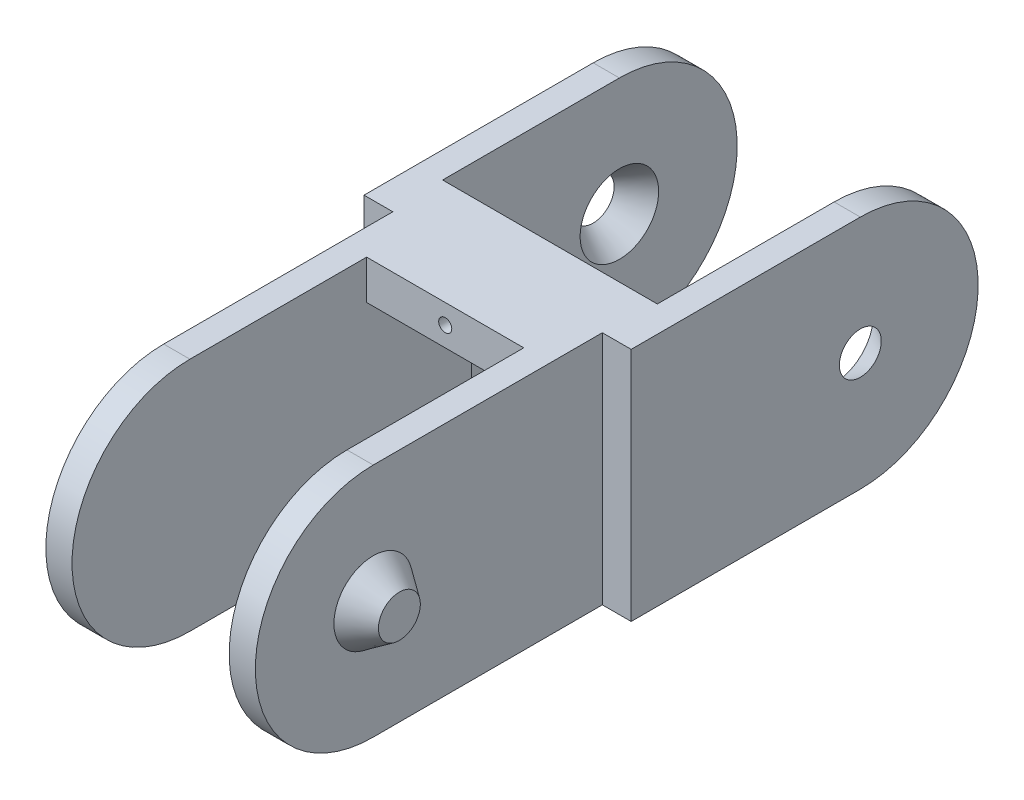
ISO-10303-21;
HEADER;
FILE_DESCRIPTION(('STEP AP214'),'2;1');
FILE_NAME('part.step','',(''),(''),'','','');
FILE_SCHEMA(('AUTOMOTIVE_DESIGN { 1 0 10303 214 1 1 1 1 }'));
ENDSEC;
DATA;
#1=APPLICATION_CONTEXT('core data for automotive mechanical design processes');
#2=APPLICATION_PROTOCOL_DEFINITION('international standard','automotive_design',2000,#1);
#3=PRODUCT_CONTEXT('',#1,'mechanical');
#4=PRODUCT('Part','Part','',(#3));
#5=PRODUCT_RELATED_PRODUCT_CATEGORY('part','',(#4));
#6=PRODUCT_DEFINITION_FORMATION('','',#4);
#7=PRODUCT_DEFINITION_CONTEXT('part definition',#1,'design');
#8=PRODUCT_DEFINITION('design','',#6,#7);
#9=PRODUCT_DEFINITION_SHAPE('','',#8);
#10=(LENGTH_UNIT() NAMED_UNIT(*) SI_UNIT(.MILLI.,.METRE.));
#11=(NAMED_UNIT(*) PLANE_ANGLE_UNIT() SI_UNIT($,.RADIAN.));
#12=(NAMED_UNIT(*) SI_UNIT($,.STERADIAN.) SOLID_ANGLE_UNIT());
#13=UNCERTAINTY_MEASURE_WITH_UNIT(LENGTH_MEASURE(1.E-05),#10,'distance_accuracy_value','');
#14=(GEOMETRIC_REPRESENTATION_CONTEXT(3) GLOBAL_UNCERTAINTY_ASSIGNED_CONTEXT((#13)) GLOBAL_UNIT_ASSIGNED_CONTEXT((#10,
#11,#12)) REPRESENTATION_CONTEXT('',''));
#15=CARTESIAN_POINT('',(0.,0.,0.));
#16=DIRECTION('',(0.,0.,1.));
#17=DIRECTION('',(1.,0.,0.));
#18=AXIS2_PLACEMENT_3D('',#15,#16,#17);
#19=CARTESIAN_POINT('',(0.,9.,4.));
#20=DIRECTION('',(0.,-1.,0.));
#21=DIRECTION('',(0.,0.,-1.));
#22=AXIS2_PLACEMENT_3D('',#19,#20,#21);
#23=PLANE('',#22);
#24=DIRECTION('',(-1.,0.,0.));
#25=VECTOR('',#24,1.);
#26=CARTESIAN_POINT('',(0.,9.,-4.));
#27=LINE('',#26,#25);
#28=CARTESIAN_POINT('',(8.2,9.,-4.));
#29=VERTEX_POINT('',#28);
#30=CARTESIAN_POINT('',(-8.2,9.,-4.));
#31=VERTEX_POINT('',#30);
#32=EDGE_CURVE('E393',#29,#31,#27,.T.);
#33=ORIENTED_EDGE('',*,*,#32,.T.);
#34=DIRECTION('',(0.,0.,-1.));
#35=VECTOR('',#34,1.);
#36=CARTESIAN_POINT('',(-8.2,9.,-4.));
#37=LINE('',#36,#35);
#38=CARTESIAN_POINT('',(-8.2,9.,-17.5));
#39=VERTEX_POINT('',#38);
#40=EDGE_CURVE('E273',#31,#39,#37,.T.);
#41=ORIENTED_EDGE('',*,*,#40,.T.);
#42=DIRECTION('',(1.,0.,0.));
#43=VECTOR('',#42,1.);
#44=CARTESIAN_POINT('',(-10.2,9.,-17.5));
#45=LINE('',#44,#43);
#46=CARTESIAN_POINT('',(-10.2,9.,-17.5));
#47=VERTEX_POINT('',#46);
#48=EDGE_CURVE('E300',#47,#39,#45,.T.);
#49=ORIENTED_EDGE('',*,*,#48,.F.);
#50=DIRECTION('',(0.,0.,1.));
#51=VECTOR('',#50,1.);
#52=CARTESIAN_POINT('',(-10.2,9.,0.));
#53=LINE('',#52,#51);
#54=CARTESIAN_POINT('',(-10.2,9.,0.));
#55=VERTEX_POINT('',#54);
#56=EDGE_CURVE('E284',#47,#55,#53,.T.);
#57=ORIENTED_EDGE('',*,*,#56,.T.);
#58=DIRECTION('',(1.,0.,0.));
#59=VECTOR('',#58,1.);
#60=CARTESIAN_POINT('',(-10.2,9.,0.));
#61=LINE('',#60,#59);
#62=CARTESIAN_POINT('',(-8.,9.,0.));
#63=VERTEX_POINT('',#62);
#64=EDGE_CURVE('E303',#55,#63,#61,.T.);
#65=ORIENTED_EDGE('',*,*,#64,.T.);
#66=DIRECTION('',(0.,0.,-1.));
#67=VECTOR('',#66,1.);
#68=CARTESIAN_POINT('',(-8.,9.,4.));
#69=LINE('',#68,#67);
#70=CARTESIAN_POINT('',(-8.,9.,17.5));
#71=VERTEX_POINT('',#70);
#72=EDGE_CURVE('E405',#71,#63,#69,.T.);
#73=ORIENTED_EDGE('',*,*,#72,.F.);
#74=DIRECTION('',(-1.,0.,0.));
#75=VECTOR('',#74,1.);
#76=CARTESIAN_POINT('',(38.0351369592827,9.,17.5));
#77=LINE('',#76,#75);
#78=CARTESIAN_POINT('',(-6.,9.,17.5));
#79=VERTEX_POINT('',#78);
#80=EDGE_CURVE('E311',#79,#71,#77,.T.);
#81=ORIENTED_EDGE('',*,*,#80,.F.);
#82=DIRECTION('',(0.,0.,1.));
#83=VECTOR('',#82,1.);
#84=CARTESIAN_POINT('',(-6.,9.,0.));
#85=LINE('',#84,#83);
#86=CARTESIAN_POINT('',(-6.,9.,4.));
#87=VERTEX_POINT('',#86);
#88=EDGE_CURVE('E320',#87,#79,#85,.T.);
#89=ORIENTED_EDGE('',*,*,#88,.F.);
#90=DIRECTION('',(-1.,0.,0.));
#91=VECTOR('',#90,1.);
#92=CARTESIAN_POINT('',(0.,9.,4.));
#93=LINE('',#92,#91);
#94=CARTESIAN_POINT('',(6.,9.,4.));
#95=VERTEX_POINT('',#94);
#96=EDGE_CURVE('E394',#95,#87,#93,.T.);
#97=ORIENTED_EDGE('',*,*,#96,.F.);
#98=DIRECTION('',(0.,0.,1.));
#99=VECTOR('',#98,1.);
#100=CARTESIAN_POINT('',(6.,9.,0.));
#101=LINE('',#100,#99);
#102=CARTESIAN_POINT('',(6.,9.,17.5));
#103=VERTEX_POINT('',#102);
#104=EDGE_CURVE('E377',#95,#103,#101,.T.);
#105=ORIENTED_EDGE('',*,*,#104,.T.);
#106=DIRECTION('',(1.,0.,0.));
#107=VECTOR('',#106,1.);
#108=CARTESIAN_POINT('',(-26.0351369592827,9.,17.5));
#109=LINE('',#108,#107);
#110=CARTESIAN_POINT('',(8.,9.,17.5));
#111=VERTEX_POINT('',#110);
#112=EDGE_CURVE('E379',#103,#111,#109,.T.);
#113=ORIENTED_EDGE('',*,*,#112,.T.);
#114=DIRECTION('',(0.,0.,-1.));
#115=VECTOR('',#114,1.);
#116=CARTESIAN_POINT('',(8.,9.,4.));
#117=LINE('',#116,#115);
#118=CARTESIAN_POINT('',(8.,9.,0.));
#119=VERTEX_POINT('',#118);
#120=EDGE_CURVE('E95',#111,#119,#117,.T.);
#121=ORIENTED_EDGE('',*,*,#120,.T.);
#122=DIRECTION('',(-1.,0.,0.));
#123=VECTOR('',#122,1.);
#124=CARTESIAN_POINT('',(10.2,9.,0.));
#125=LINE('',#124,#123);
#126=CARTESIAN_POINT('',(10.2,9.,0.));
#127=VERTEX_POINT('',#126);
#128=EDGE_CURVE('E357',#127,#119,#125,.T.);
#129=ORIENTED_EDGE('',*,*,#128,.F.);
#130=DIRECTION('',(0.,0.,1.));
#131=VECTOR('',#130,1.);
#132=CARTESIAN_POINT('',(10.2,9.,0.));
#133=LINE('',#132,#131);
#134=CARTESIAN_POINT('',(10.2,9.,-17.5));
#135=VERTEX_POINT('',#134);
#136=EDGE_CURVE('E355',#135,#127,#133,.T.);
#137=ORIENTED_EDGE('',*,*,#136,.F.);
#138=DIRECTION('',(-1.,0.,0.));
#139=VECTOR('',#138,1.);
#140=CARTESIAN_POINT('',(10.2,9.,-17.5));
#141=LINE('',#140,#139);
#142=CARTESIAN_POINT('',(8.2,9.,-17.5));
#143=VERTEX_POINT('',#142);
#144=EDGE_CURVE('E362',#135,#143,#141,.T.);
#145=ORIENTED_EDGE('',*,*,#144,.T.);
#146=DIRECTION('',(0.,0.,-1.));
#147=VECTOR('',#146,1.);
#148=CARTESIAN_POINT('',(8.2,9.,-4.));
#149=LINE('',#148,#147);
#150=EDGE_CURVE('E342',#29,#143,#149,.T.);
#151=ORIENTED_EDGE('',*,*,#150,.F.);
#152=EDGE_LOOP('',(#33,#41,#49,#57,#65,#73,#81,#89,#97,#105,#113,#121,#129,#137,#145,#151));
#153=FACE_BOUND('',#152,.T.);
#154=ADVANCED_FACE('F87',(#153),#23,.F.);
#155=CARTESIAN_POINT('',(0.,-9.,4.));
#156=DIRECTION('',(0.,1.,0.));
#157=DIRECTION('',(0.,0.,1.));
#158=AXIS2_PLACEMENT_3D('',#155,#156,#157);
#159=PLANE('',#158);
#160=DIRECTION('',(0.,0.,1.));
#161=VECTOR('',#160,1.);
#162=CARTESIAN_POINT('',(-8.2,-9.,-4.));
#163=LINE('',#162,#161);
#164=CARTESIAN_POINT('',(-8.2,-9.,-17.5));
#165=VERTEX_POINT('',#164);
#166=CARTESIAN_POINT('',(-8.2,-9.,-4.));
#167=VERTEX_POINT('',#166);
#168=EDGE_CURVE('E110',#165,#167,#163,.T.);
#169=ORIENTED_EDGE('',*,*,#168,.T.);
#170=DIRECTION('',(1.,0.,0.));
#171=VECTOR('',#170,1.);
#172=CARTESIAN_POINT('',(0.,-9.,-4.));
#173=LINE('',#172,#171);
#174=CARTESIAN_POINT('',(8.2,-9.,-4.));
#175=VERTEX_POINT('',#174);
#176=EDGE_CURVE('E396',#167,#175,#173,.T.);
#177=ORIENTED_EDGE('',*,*,#176,.T.);
#178=DIRECTION('',(0.,0.,1.));
#179=VECTOR('',#178,1.);
#180=CARTESIAN_POINT('',(8.2,-9.,-4.));
#181=LINE('',#180,#179);
#182=CARTESIAN_POINT('',(8.2,-9.,-17.5));
#183=VERTEX_POINT('',#182);
#184=EDGE_CURVE('E339',#183,#175,#181,.T.);
#185=ORIENTED_EDGE('',*,*,#184,.F.);
#186=DIRECTION('',(-1.,0.,0.));
#187=VECTOR('',#186,1.);
#188=CARTESIAN_POINT('',(10.2,-9.,-17.5));
#189=LINE('',#188,#187);
#190=CARTESIAN_POINT('',(10.2,-9.,-17.5));
#191=VERTEX_POINT('',#190);
#192=EDGE_CURVE('E365',#191,#183,#189,.T.);
#193=ORIENTED_EDGE('',*,*,#192,.F.);
#194=DIRECTION('',(0.,0.,-1.));
#195=VECTOR('',#194,1.);
#196=CARTESIAN_POINT('',(10.2,-9.,0.));
#197=LINE('',#196,#195);
#198=CARTESIAN_POINT('',(10.2,-9.,0.));
#199=VERTEX_POINT('',#198);
#200=EDGE_CURVE('E351',#199,#191,#197,.T.);
#201=ORIENTED_EDGE('',*,*,#200,.F.);
#202=DIRECTION('',(-1.,0.,0.));
#203=VECTOR('',#202,1.);
#204=CARTESIAN_POINT('',(10.2,-9.,0.));
#205=LINE('',#204,#203);
#206=CARTESIAN_POINT('',(8.,-9.,0.));
#207=VERTEX_POINT('',#206);
#208=EDGE_CURVE('E368',#199,#207,#205,.T.);
#209=ORIENTED_EDGE('',*,*,#208,.T.);
#210=DIRECTION('',(0.,0.,-1.));
#211=VECTOR('',#210,1.);
#212=CARTESIAN_POINT('',(8.,-9.,4.));
#213=LINE('',#212,#211);
#214=CARTESIAN_POINT('',(8.,-9.00000000000001,17.5));
#215=VERTEX_POINT('',#214);
#216=EDGE_CURVE('E398',#215,#207,#213,.T.);
#217=ORIENTED_EDGE('',*,*,#216,.F.);
#218=DIRECTION('',(1.,0.,0.));
#219=VECTOR('',#218,1.);
#220=CARTESIAN_POINT('',(-26.0351369592827,-9.00000000000001,17.5));
#221=LINE('',#220,#219);
#222=CARTESIAN_POINT('',(6.,-9.00000000000001,17.5));
#223=VERTEX_POINT('',#222);
#224=EDGE_CURVE('E381',#223,#215,#221,.T.);
#225=ORIENTED_EDGE('',*,*,#224,.F.);
#226=DIRECTION('',(0.,0.,-1.));
#227=VECTOR('',#226,1.);
#228=CARTESIAN_POINT('',(6.,-9.,0.));
#229=LINE('',#228,#227);
#230=CARTESIAN_POINT('',(6.,-9.,4.));
#231=VERTEX_POINT('',#230);
#232=EDGE_CURVE('E237',#223,#231,#229,.T.);
#233=ORIENTED_EDGE('',*,*,#232,.T.);
#234=DIRECTION('',(1.,0.,0.));
#235=VECTOR('',#234,1.);
#236=CARTESIAN_POINT('',(0.,-9.,4.));
#237=LINE('',#236,#235);
#238=CARTESIAN_POINT('',(-6.,-9.,4.));
#239=VERTEX_POINT('',#238);
#240=EDGE_CURVE('E232',#239,#231,#237,.T.);
#241=ORIENTED_EDGE('',*,*,#240,.F.);
#242=DIRECTION('',(0.,0.,-1.));
#243=VECTOR('',#242,1.);
#244=CARTESIAN_POINT('',(-6.,-9.,0.));
#245=LINE('',#244,#243);
#246=CARTESIAN_POINT('',(-6.,-9.00000000000001,17.5));
#247=VERTEX_POINT('',#246);
#248=EDGE_CURVE('E322',#247,#239,#245,.T.);
#249=ORIENTED_EDGE('',*,*,#248,.F.);
#250=DIRECTION('',(-1.,0.,0.));
#251=VECTOR('',#250,1.);
#252=CARTESIAN_POINT('',(38.0351369592827,-9.00000000000001,17.5));
#253=LINE('',#252,#251);
#254=CARTESIAN_POINT('',(-8.,-9.00000000000001,17.5));
#255=VERTEX_POINT('',#254);
#256=EDGE_CURVE('E315',#247,#255,#253,.T.);
#257=ORIENTED_EDGE('',*,*,#256,.T.);
#258=DIRECTION('',(0.,0.,-1.));
#259=VECTOR('',#258,1.);
#260=CARTESIAN_POINT('',(-8.,-9.,4.));
#261=LINE('',#260,#259);
#262=CARTESIAN_POINT('',(-8.,-9.,0.));
#263=VERTEX_POINT('',#262);
#264=EDGE_CURVE('E402',#255,#263,#261,.T.);
#265=ORIENTED_EDGE('',*,*,#264,.T.);
#266=DIRECTION('',(1.,0.,0.));
#267=VECTOR('',#266,1.);
#268=CARTESIAN_POINT('',(-10.2,-9.,0.));
#269=LINE('',#268,#267);
#270=CARTESIAN_POINT('',(-10.2,-9.,0.));
#271=VERTEX_POINT('',#270);
#272=EDGE_CURVE('E293',#271,#263,#269,.T.);
#273=ORIENTED_EDGE('',*,*,#272,.F.);
#274=DIRECTION('',(0.,0.,-1.));
#275=VECTOR('',#274,1.);
#276=CARTESIAN_POINT('',(-10.2,-9.,0.));
#277=LINE('',#276,#275);
#278=CARTESIAN_POINT('',(-10.2,-9.,-17.5));
#279=VERTEX_POINT('',#278);
#280=EDGE_CURVE('E290',#271,#279,#277,.T.);
#281=ORIENTED_EDGE('',*,*,#280,.T.);
#282=DIRECTION('',(1.,0.,0.));
#283=VECTOR('',#282,1.);
#284=CARTESIAN_POINT('',(-10.2,-9.,-17.5));
#285=LINE('',#284,#283);
#286=EDGE_CURVE('E297',#279,#165,#285,.T.);
#287=ORIENTED_EDGE('',*,*,#286,.T.);
#288=EDGE_LOOP('',(#169,#177,#185,#193,#201,#209,#217,#225,#233,#241,#249,#257,#265,#273,#281,#287));
#289=FACE_BOUND('',#288,.T.);
#290=ADVANCED_FACE('F431',(#289),#159,.F.);
#291=CARTESIAN_POINT('',(-10.2,0.,-17.5));
#292=DIRECTION('',(1.,0.,0.));
#293=DIRECTION('',(0.,0.,-1.));
#294=AXIS2_PLACEMENT_3D('',#291,#292,#293);
#295=CYLINDRICAL_SURFACE('',#294,9.);
#296=ORIENTED_EDGE('',*,*,#48,.T.);
#297=CARTESIAN_POINT('',(-8.2,0.,-17.5));
#298=DIRECTION('',(1.,0.,0.));
#299=DIRECTION('',(0.,0.,-1.));
#300=AXIS2_PLACEMENT_3D('',#297,#298,#299);
#301=CIRCLE('',#300,9.);
#302=EDGE_CURVE('E269',#165,#39,#301,.T.);
#303=ORIENTED_EDGE('',*,*,#302,.F.);
#304=ORIENTED_EDGE('',*,*,#286,.F.);
#305=CARTESIAN_POINT('',(-10.2,0.,-17.5));
#306=DIRECTION('',(1.,0.,0.));
#307=DIRECTION('',(0.,0.,1.));
#308=AXIS2_PLACEMENT_3D('',#305,#306,#307);
#309=CIRCLE('',#308,9.);
#310=EDGE_CURVE('E287',#279,#47,#309,.T.);
#311=ORIENTED_EDGE('',*,*,#310,.T.);
#312=EDGE_LOOP('',(#296,#303,#304,#311));
#313=FACE_BOUND('',#312,.T.);
#314=ADVANCED_FACE('F438',(#313),#295,.T.);
#315=CARTESIAN_POINT('',(0.,0.,4.));
#316=DIRECTION('',(0.,0.,1.));
#317=DIRECTION('',(1.,0.,0.));
#318=AXIS2_PLACEMENT_3D('',#315,#316,#317);
#319=PLANE('',#318);
#320=CARTESIAN_POINT('',(0.,-7.5,4.));
#321=DIRECTION('',(0.,0.,-1.));
#322=DIRECTION('',(1.,0.,0.));
#323=AXIS2_PLACEMENT_3D('',#320,#321,#322);
#324=CIRCLE('',#323,0.499999999999999);
#325=CARTESIAN_POINT('',(0.5,-7.5,4.));
#326=VERTEX_POINT('',#325);
#327=EDGE_CURVE('E477',#326,#326,#324,.T.);
#328=ORIENTED_EDGE('',*,*,#327,.T.);
#329=EDGE_LOOP('',(#328));
#330=FACE_BOUND('',#329,.T.);
#331=DIRECTION('',(0.,1.,0.));
#332=VECTOR('',#331,1.);
#333=CARTESIAN_POINT('',(-6.,0.,4.));
#334=LINE('',#333,#332);
#335=CARTESIAN_POINT('',(-6.,-6.,4.));
#336=VERTEX_POINT('',#335);
#337=EDGE_CURVE('E329',#239,#336,#334,.T.);
#338=ORIENTED_EDGE('',*,*,#337,.F.);
#339=ORIENTED_EDGE('',*,*,#240,.T.);
#340=DIRECTION('',(0.,-1.,0.));
#341=VECTOR('',#340,1.);
#342=CARTESIAN_POINT('',(6.,0.,4.));
#343=LINE('',#342,#341);
#344=CARTESIAN_POINT('',(6.,-6.,4.));
#345=VERTEX_POINT('',#344);
#346=EDGE_CURVE('E227',#345,#231,#343,.T.);
#347=ORIENTED_EDGE('',*,*,#346,.F.);
#348=DIRECTION('',(1.,0.,0.));
#349=VECTOR('',#348,1.);
#350=CARTESIAN_POINT('',(-6.,-6.,4.));
#351=LINE('',#350,#349);
#352=EDGE_CURVE('E230',#336,#345,#351,.T.);
#353=ORIENTED_EDGE('',*,*,#352,.F.);
#354=EDGE_LOOP('',(#338,#339,#347,#353));
#355=FACE_BOUND('',#354,.T.);
#356=ADVANCED_FACE('F229',(#330,#355),#319,.T.);
#357=CARTESIAN_POINT('',(8.,0.,4.));
#358=DIRECTION('',(-1.,0.,0.));
#359=DIRECTION('',(0.,0.,1.));
#360=AXIS2_PLACEMENT_3D('',#357,#358,#359);
#361=PLANE('',#360);
#362=CARTESIAN_POINT('',(8.,0.,17.5));
#363=DIRECTION('',(-1.,0.,0.));
#364=DIRECTION('',(0.,0.,1.));
#365=AXIS2_PLACEMENT_3D('',#362,#363,#364);
#366=CIRCLE('',#365,3.);
#367=CARTESIAN_POINT('',(8.,0.,20.5));
#368=VERTEX_POINT('',#367);
#369=EDGE_CURVE('E12',#368,#368,#366,.F.);
#370=ORIENTED_EDGE('',*,*,#369,.F.);
#371=EDGE_LOOP('',(#370));
#372=FACE_BOUND('',#371,.T.);
#373=ORIENTED_EDGE('',*,*,#216,.T.);
#374=DIRECTION('',(0.,-1.,0.));
#375=VECTOR('',#374,1.);
#376=CARTESIAN_POINT('',(8.,9.,0.));
#377=LINE('',#376,#375);
#378=EDGE_CURVE('E347',#119,#207,#377,.T.);
#379=ORIENTED_EDGE('',*,*,#378,.F.);
#380=ORIENTED_EDGE('',*,*,#120,.F.);
#381=CARTESIAN_POINT('',(8.,0.,17.5));
#382=DIRECTION('',(1.,0.,0.));
#383=DIRECTION('',(0.,0.,-1.));
#384=AXIS2_PLACEMENT_3D('',#381,#382,#383);
#385=CIRCLE('',#384,9.);
#386=EDGE_CURVE('E374',#111,#215,#385,.T.);
#387=ORIENTED_EDGE('',*,*,#386,.T.);
#388=EDGE_LOOP('',(#373,#379,#380,#387));
#389=FACE_BOUND('',#388,.T.);
#390=ADVANCED_FACE('F89',(#372,#389),#361,.F.);
#391=CARTESIAN_POINT('',(0.,7.5,4.));
#392=DIRECTION('',(0.,0.,1.));
#393=DIRECTION('',(1.,0.,0.));
#394=AXIS2_PLACEMENT_3D('',#391,#392,#393);
#395=CIRCLE('',#394,0.499999999999999);
#396=CARTESIAN_POINT('',(0.5,7.5,4.));
#397=VERTEX_POINT('',#396);
#398=EDGE_CURVE('E474',#397,#397,#395,.T.);
#399=ORIENTED_EDGE('',*,*,#398,.F.);
#400=EDGE_LOOP('',(#399));
#401=FACE_BOUND('',#400,.T.);
#402=CARTESIAN_POINT('',(-6.,6.,4.));
#403=VERTEX_POINT('',#402);
#404=EDGE_CURVE('E319',#403,#87,#334,.T.);
#405=ORIENTED_EDGE('',*,*,#404,.F.);
#406=DIRECTION('',(1.,0.,0.));
#407=VECTOR('',#406,1.);
#408=CARTESIAN_POINT('',(-6.,6.,4.));
#409=LINE('',#408,#407);
#410=CARTESIAN_POINT('',(6.,6.,4.));
#411=VERTEX_POINT('',#410);
#412=EDGE_CURVE('E256',#403,#411,#409,.T.);
#413=ORIENTED_EDGE('',*,*,#412,.T.);
#414=EDGE_CURVE('E236',#95,#411,#343,.T.);
#415=ORIENTED_EDGE('',*,*,#414,.F.);
#416=ORIENTED_EDGE('',*,*,#96,.T.);
#417=EDGE_LOOP('',(#405,#413,#415,#416));
#418=FACE_BOUND('',#417,.T.);
#419=ADVANCED_FACE('F463',(#401,#418),#319,.T.);
#420=CARTESIAN_POINT('',(0.,0.,-4.));
#421=DIRECTION('',(0.,0.,1.));
#422=DIRECTION('',(1.,0.,0.));
#423=AXIS2_PLACEMENT_3D('',#420,#421,#422);
#424=PLANE('',#423);
#425=CARTESIAN_POINT('',(0.,-7.5,-4.));
#426=DIRECTION('',(0.,0.,1.));
#427=DIRECTION('',(1.,0.,0.));
#428=AXIS2_PLACEMENT_3D('',#425,#426,#427);
#429=CIRCLE('',#428,0.499999999999999);
#430=CARTESIAN_POINT('',(0.5,-7.5,-4.));
#431=VERTEX_POINT('',#430);
#432=EDGE_CURVE('E478',#431,#431,#429,.T.);
#433=ORIENTED_EDGE('',*,*,#432,.T.);
#434=EDGE_LOOP('',(#433));
#435=FACE_BOUND('',#434,.T.);
#436=CARTESIAN_POINT('',(0.,7.5,-4.));
#437=DIRECTION('',(0.,0.,1.));
#438=DIRECTION('',(1.,0.,0.));
#439=AXIS2_PLACEMENT_3D('',#436,#437,#438);
#440=CIRCLE('',#439,0.499999999999999);
#441=CARTESIAN_POINT('',(0.5,7.5,-4.));
#442=VERTEX_POINT('',#441);
#443=EDGE_CURVE('E247',#442,#442,#440,.F.);
#444=ORIENTED_EDGE('',*,*,#443,.F.);
#445=EDGE_LOOP('',(#444));
#446=FACE_BOUND('',#445,.T.);
#447=DIRECTION('',(-1.,0.,0.));
#448=VECTOR('',#447,1.);
#449=CARTESIAN_POINT('',(-6.,-6.,-4.));
#450=LINE('',#449,#448);
#451=CARTESIAN_POINT('',(6.,-6.,-4.));
#452=VERTEX_POINT('',#451);
#453=CARTESIAN_POINT('',(-6.,-6.,-4.));
#454=VERTEX_POINT('',#453);
#455=EDGE_CURVE('E253',#452,#454,#450,.T.);
#456=ORIENTED_EDGE('',*,*,#455,.F.);
#457=DIRECTION('',(0.,1.,0.));
#458=VECTOR('',#457,1.);
#459=CARTESIAN_POINT('',(6.,-7.,-4.));
#460=LINE('',#459,#458);
#461=CARTESIAN_POINT('',(6.,6.,-4.));
#462=VERTEX_POINT('',#461);
#463=EDGE_CURVE('E251',#452,#462,#460,.T.);
#464=ORIENTED_EDGE('',*,*,#463,.T.);
#465=DIRECTION('',(-1.,0.,0.));
#466=VECTOR('',#465,1.);
#467=CARTESIAN_POINT('',(-6.,6.,-4.));
#468=LINE('',#467,#466);
#469=CARTESIAN_POINT('',(-6.,6.,-4.));
#470=VERTEX_POINT('',#469);
#471=EDGE_CURVE('E262',#462,#470,#468,.T.);
#472=ORIENTED_EDGE('',*,*,#471,.T.);
#473=DIRECTION('',(0.,-1.,0.));
#474=VECTOR('',#473,1.);
#475=CARTESIAN_POINT('',(-6.,-7.,-4.));
#476=LINE('',#475,#474);
#477=EDGE_CURVE('E390',#470,#454,#476,.T.);
#478=ORIENTED_EDGE('',*,*,#477,.T.);
#479=EDGE_LOOP('',(#456,#464,#472,#478));
#480=FACE_BOUND('',#479,.T.);
#481=DIRECTION('',(0.,1.,0.));
#482=VECTOR('',#481,1.);
#483=CARTESIAN_POINT('',(8.2,-9.001,-4.));
#484=LINE('',#483,#482);
#485=EDGE_CURVE('E344',#175,#29,#484,.T.);
#486=ORIENTED_EDGE('',*,*,#485,.F.);
#487=ORIENTED_EDGE('',*,*,#176,.F.);
#488=DIRECTION('',(0.,1.,0.));
#489=VECTOR('',#488,1.);
#490=CARTESIAN_POINT('',(-8.2,-9.001,-4.));
#491=LINE('',#490,#489);
#492=EDGE_CURVE('E276',#167,#31,#491,.T.);
#493=ORIENTED_EDGE('',*,*,#492,.T.);
#494=ORIENTED_EDGE('',*,*,#32,.F.);
#495=EDGE_LOOP('',(#486,#487,#493,#494));
#496=FACE_BOUND('',#495,.T.);
#497=ADVANCED_FACE('F434',(#435,#446,#480,#496),#424,.F.);
#498=CARTESIAN_POINT('',(-8.,0.,4.));
#499=DIRECTION('',(1.,0.,0.));
#500=DIRECTION('',(0.,0.,-1.));
#501=AXIS2_PLACEMENT_3D('',#498,#499,#500);
#502=PLANE('',#501);
#503=CARTESIAN_POINT('',(-8.,0.,17.5));
#504=DIRECTION('',(1.,0.,0.));
#505=DIRECTION('',(0.,0.,-1.));
#506=AXIS2_PLACEMENT_3D('',#503,#504,#505);
#507=CIRCLE('',#506,3.);
#508=CARTESIAN_POINT('',(-8.,0.,14.5));
#509=VERTEX_POINT('',#508);
#510=EDGE_CURVE('E305',#509,#509,#507,.T.);
#511=ORIENTED_EDGE('',*,*,#510,.T.);
#512=EDGE_LOOP('',(#511));
#513=FACE_BOUND('',#512,.T.);
#514=ORIENTED_EDGE('',*,*,#72,.T.);
#515=DIRECTION('',(0.,-1.,0.));
#516=VECTOR('',#515,1.);
#517=CARTESIAN_POINT('',(-8.,9.,0.));
#518=LINE('',#517,#516);
#519=EDGE_CURVE('E280',#63,#263,#518,.T.);
#520=ORIENTED_EDGE('',*,*,#519,.T.);
#521=ORIENTED_EDGE('',*,*,#264,.F.);
#522=CARTESIAN_POINT('',(-8.,0.,17.5));
#523=DIRECTION('',(1.,0.,0.));
#524=DIRECTION('',(0.,0.,-1.));
#525=AXIS2_PLACEMENT_3D('',#522,#523,#524);
#526=CIRCLE('',#525,9.);
#527=EDGE_CURVE('E312',#71,#255,#526,.T.);
#528=ORIENTED_EDGE('',*,*,#527,.F.);
#529=EDGE_LOOP('',(#514,#520,#521,#528));
#530=FACE_BOUND('',#529,.T.);
#531=ADVANCED_FACE('F450',(#513,#530),#502,.F.);
#532=CARTESIAN_POINT('',(6.,-7.,4.));
#533=DIRECTION('',(-1.,0.,0.));
#534=DIRECTION('',(0.,0.,1.));
#535=AXIS2_PLACEMENT_3D('',#532,#533,#534);
#536=PLANE('',#535);
#537=DIRECTION('',(0.,0.,1.));
#538=VECTOR('',#537,1.);
#539=CARTESIAN_POINT('',(6.,-6.,-16.0415945787923));
#540=LINE('',#539,#538);
#541=EDGE_CURVE('E243',#452,#345,#540,.T.);
#542=ORIENTED_EDGE('',*,*,#541,.T.);
#543=ORIENTED_EDGE('',*,*,#346,.T.);
#544=ORIENTED_EDGE('',*,*,#232,.F.);
#545=CARTESIAN_POINT('',(6.,0.,17.5));
#546=DIRECTION('',(-1.,0.,0.));
#547=DIRECTION('',(0.,0.,1.));
#548=AXIS2_PLACEMENT_3D('',#545,#546,#547);
#549=CIRCLE('',#548,9.);
#550=EDGE_CURVE('E382',#103,#223,#549,.F.);
#551=ORIENTED_EDGE('',*,*,#550,.F.);
#552=ORIENTED_EDGE('',*,*,#104,.F.);
#553=ORIENTED_EDGE('',*,*,#414,.T.);
#554=DIRECTION('',(0.,0.,1.));
#555=VECTOR('',#554,1.);
#556=CARTESIAN_POINT('',(6.,6.,-16.0415945787923));
#557=LINE('',#556,#555);
#558=EDGE_CURVE('E259',#462,#411,#557,.T.);
#559=ORIENTED_EDGE('',*,*,#558,.F.);
#560=ORIENTED_EDGE('',*,*,#463,.F.);
#561=EDGE_LOOP('',(#542,#543,#544,#551,#552,#553,#559,#560));
#562=FACE_BOUND('',#561,.T.);
#563=ADVANCED_FACE('F249',(#562),#536,.T.);
#564=CARTESIAN_POINT('',(-6.,-7.,4.));
#565=DIRECTION('',(1.,0.,0.));
#566=DIRECTION('',(0.,0.,-1.));
#567=AXIS2_PLACEMENT_3D('',#564,#565,#566);
#568=PLANE('',#567);
#569=ORIENTED_EDGE('',*,*,#337,.T.);
#570=DIRECTION('',(0.,0.,1.));
#571=VECTOR('',#570,1.);
#572=CARTESIAN_POINT('',(-6.,-6.,-16.0415945787923));
#573=LINE('',#572,#571);
#574=EDGE_CURVE('E246',#454,#336,#573,.T.);
#575=ORIENTED_EDGE('',*,*,#574,.F.);
#576=ORIENTED_EDGE('',*,*,#477,.F.);
#577=DIRECTION('',(0.,0.,1.));
#578=VECTOR('',#577,1.);
#579=CARTESIAN_POINT('',(-6.,6.,-16.0415945787923));
#580=LINE('',#579,#578);
#581=EDGE_CURVE('E102',#470,#403,#580,.T.);
#582=ORIENTED_EDGE('',*,*,#581,.T.);
#583=ORIENTED_EDGE('',*,*,#404,.T.);
#584=ORIENTED_EDGE('',*,*,#88,.T.);
#585=CARTESIAN_POINT('',(-6.,0.,17.5));
#586=DIRECTION('',(1.,0.,0.));
#587=DIRECTION('',(0.,0.,-1.));
#588=AXIS2_PLACEMENT_3D('',#585,#586,#587);
#589=CIRCLE('',#588,9.);
#590=EDGE_CURVE('E316',#79,#247,#589,.T.);
#591=ORIENTED_EDGE('',*,*,#590,.T.);
#592=ORIENTED_EDGE('',*,*,#248,.T.);
#593=EDGE_LOOP('',(#569,#575,#576,#582,#583,#584,#591,#592));
#594=FACE_BOUND('',#593,.T.);
#595=ADVANCED_FACE('F460',(#594),#568,.T.);
#596=CARTESIAN_POINT('',(-26.0351369592827,0.,17.5));
#597=DIRECTION('',(1.,0.,0.));
#598=DIRECTION('',(0.,0.,-1.));
#599=AXIS2_PLACEMENT_3D('',#596,#597,#598);
#600=CYLINDRICAL_SURFACE('',#599,9.);
#601=ORIENTED_EDGE('',*,*,#112,.F.);
#602=ORIENTED_EDGE('',*,*,#550,.T.);
#603=ORIENTED_EDGE('',*,*,#224,.T.);
#604=ORIENTED_EDGE('',*,*,#386,.F.);
#605=EDGE_LOOP('',(#601,#602,#603,#604));
#606=FACE_BOUND('',#605,.T.);
#607=ADVANCED_FACE('F468',(#606),#600,.T.);
#608=CARTESIAN_POINT('',(8.,0.,17.5));
#609=DIRECTION('',(-1.,0.,0.));
#610=DIRECTION('',(0.,0.,-1.));
#611=AXIS2_PLACEMENT_3D('',#608,#609,#610);
#612=CONICAL_SURFACE('',#611,3.,0.610865238198016);
#613=CARTESIAN_POINT('',(10.,0.,17.5));
#614=DIRECTION('',(1.,0.,0.));
#615=DIRECTION('',(0.,0.,-1.));
#616=AXIS2_PLACEMENT_3D('',#613,#614,#615);
#617=CIRCLE('',#616,1.59958492358058);
#618=CARTESIAN_POINT('',(10.,0.,15.9004150764194));
#619=VERTEX_POINT('',#618);
#620=EDGE_CURVE('E371',#619,#619,#617,.T.);
#621=ORIENTED_EDGE('',*,*,#620,.F.);
#622=EDGE_LOOP('',(#621));
#623=FACE_BOUND('',#622,.T.);
#624=ORIENTED_EDGE('',*,*,#369,.T.);
#625=EDGE_LOOP('',(#624));
#626=FACE_BOUND('',#625,.T.);
#627=ADVANCED_FACE('F524',(#623,#626),#612,.T.);
#628=CARTESIAN_POINT('',(10.,0.,17.5));
#629=DIRECTION('',(1.,0.,0.));
#630=DIRECTION('',(0.,0.,-1.));
#631=AXIS2_PLACEMENT_3D('',#628,#629,#630);
#632=PLANE('',#631);
#633=ORIENTED_EDGE('',*,*,#620,.T.);
#634=EDGE_LOOP('',(#633));
#635=FACE_BOUND('',#634,.T.);
#636=ADVANCED_FACE('F527',(#635),#632,.T.);
#637=CARTESIAN_POINT('',(10.2,9.,0.));
#638=DIRECTION('',(0.,0.,-1.));
#639=DIRECTION('',(0.,1.,0.));
#640=AXIS2_PLACEMENT_3D('',#637,#638,#639);
#641=PLANE('',#640);
#642=ORIENTED_EDGE('',*,*,#378,.T.);
#643=ORIENTED_EDGE('',*,*,#208,.F.);
#644=DIRECTION('',(0.,-1.,0.));
#645=VECTOR('',#644,1.);
#646=CARTESIAN_POINT('',(10.2,9.,0.));
#647=LINE('',#646,#645);
#648=EDGE_CURVE('E348',#127,#199,#647,.T.);
#649=ORIENTED_EDGE('',*,*,#648,.F.);
#650=ORIENTED_EDGE('',*,*,#128,.T.);
#651=EDGE_LOOP('',(#642,#643,#649,#650));
#652=FACE_BOUND('',#651,.T.);
#653=ADVANCED_FACE('F417',(#652),#641,.F.);
#654=CARTESIAN_POINT('',(10.2,0.,-17.5));
#655=DIRECTION('',(-1.,0.,0.));
#656=DIRECTION('',(0.,0.,1.));
#657=AXIS2_PLACEMENT_3D('',#654,#655,#656);
#658=CYLINDRICAL_SURFACE('',#657,9.);
#659=ORIENTED_EDGE('',*,*,#192,.T.);
#660=CARTESIAN_POINT('',(8.2,0.,-17.5));
#661=DIRECTION('',(1.,0.,0.));
#662=DIRECTION('',(0.,0.,-1.));
#663=AXIS2_PLACEMENT_3D('',#660,#661,#662);
#664=CIRCLE('',#663,9.);
#665=EDGE_CURVE('E337',#143,#183,#664,.F.);
#666=ORIENTED_EDGE('',*,*,#665,.F.);
#667=ORIENTED_EDGE('',*,*,#144,.F.);
#668=CARTESIAN_POINT('',(10.2,0.,-17.5));
#669=DIRECTION('',(1.,0.,0.));
#670=DIRECTION('',(0.,0.,1.));
#671=AXIS2_PLACEMENT_3D('',#668,#669,#670);
#672=CIRCLE('',#671,9.);
#673=EDGE_CURVE('E353',#191,#135,#672,.T.);
#674=ORIENTED_EDGE('',*,*,#673,.F.);
#675=EDGE_LOOP('',(#659,#666,#667,#674));
#676=FACE_BOUND('',#675,.T.);
#677=ADVANCED_FACE('F426',(#676),#658,.T.);
#678=CARTESIAN_POINT('',(10.2,0.,-17.5));
#679=DIRECTION('',(-1.,0.,0.));
#680=DIRECTION('',(0.,0.,1.));
#681=AXIS2_PLACEMENT_3D('',#678,#679,#680);
#682=PLANE('',#681);
#683=CARTESIAN_POINT('',(10.2,0.,-17.5));
#684=DIRECTION('',(-1.,0.,0.));
#685=DIRECTION('',(0.,0.,1.));
#686=AXIS2_PLACEMENT_3D('',#683,#684,#685);
#687=CIRCLE('',#686,1.59958492358058);
#688=CARTESIAN_POINT('',(10.2,0.,-15.9004150764194));
#689=VERTEX_POINT('',#688);
#690=EDGE_CURVE('E334',#689,#689,#687,.F.);
#691=ORIENTED_EDGE('',*,*,#690,.F.);
#692=EDGE_LOOP('',(#691));
#693=FACE_BOUND('',#692,.T.);
#694=ORIENTED_EDGE('',*,*,#648,.T.);
#695=ORIENTED_EDGE('',*,*,#200,.T.);
#696=ORIENTED_EDGE('',*,*,#673,.T.);
#697=ORIENTED_EDGE('',*,*,#136,.T.);
#698=EDGE_LOOP('',(#694,#695,#696,#697));
#699=FACE_BOUND('',#698,.T.);
#700=ADVANCED_FACE('F419',(#693,#699),#682,.F.);
#701=CARTESIAN_POINT('',(8.2,-9.001,-4.));
#702=DIRECTION('',(1.,0.,0.));
#703=DIRECTION('',(0.,0.,-1.));
#704=AXIS2_PLACEMENT_3D('',#701,#702,#703);
#705=PLANE('',#704);
#706=CARTESIAN_POINT('',(8.2,0.,-17.5));
#707=DIRECTION('',(-1.,0.,0.));
#708=DIRECTION('',(0.,0.,1.));
#709=AXIS2_PLACEMENT_3D('',#706,#707,#708);
#710=CIRCLE('',#709,3.);
#711=CARTESIAN_POINT('',(8.2,0.,-14.5));
#712=VERTEX_POINT('',#711);
#713=EDGE_CURVE('E331',#712,#712,#710,.T.);
#714=ORIENTED_EDGE('',*,*,#713,.F.);
#715=EDGE_LOOP('',(#714));
#716=FACE_BOUND('',#715,.T.);
#717=ORIENTED_EDGE('',*,*,#184,.T.);
#718=ORIENTED_EDGE('',*,*,#485,.T.);
#719=ORIENTED_EDGE('',*,*,#150,.T.);
#720=ORIENTED_EDGE('',*,*,#665,.T.);
#721=EDGE_LOOP('',(#717,#718,#719,#720));
#722=FACE_BOUND('',#721,.T.);
#723=ADVANCED_FACE('F429',(#716,#722),#705,.F.);
#724=CARTESIAN_POINT('',(8.2,0.,-17.5));
#725=DIRECTION('',(-1.,0.,0.));
#726=DIRECTION('',(0.,0.,1.));
#727=AXIS2_PLACEMENT_3D('',#724,#725,#726);
#728=CONICAL_SURFACE('',#727,3.,0.610865238198016);
#729=ORIENTED_EDGE('',*,*,#713,.T.);
#730=EDGE_LOOP('',(#729));
#731=FACE_BOUND('',#730,.T.);
#732=ORIENTED_EDGE('',*,*,#690,.T.);
#733=EDGE_LOOP('',(#732));
#734=FACE_BOUND('',#733,.T.);
#735=ADVANCED_FACE('F541',(#731,#734),#728,.F.);
#736=CARTESIAN_POINT('',(38.0351369592827,0.,17.5));
#737=DIRECTION('',(-1.,0.,0.));
#738=DIRECTION('',(0.,0.,1.));
#739=AXIS2_PLACEMENT_3D('',#736,#737,#738);
#740=CYLINDRICAL_SURFACE('',#739,9.);
#741=ORIENTED_EDGE('',*,*,#590,.F.);
#742=ORIENTED_EDGE('',*,*,#80,.T.);
#743=ORIENTED_EDGE('',*,*,#527,.T.);
#744=ORIENTED_EDGE('',*,*,#256,.F.);
#745=EDGE_LOOP('',(#741,#742,#743,#744));
#746=FACE_BOUND('',#745,.T.);
#747=ADVANCED_FACE('F453',(#746),#740,.T.);
#748=CARTESIAN_POINT('',(-8.,0.,17.5));
#749=DIRECTION('',(1.,0.,0.));
#750=DIRECTION('',(0.,0.,-1.));
#751=AXIS2_PLACEMENT_3D('',#748,#749,#750);
#752=CONICAL_SURFACE('',#751,3.,0.610865238198016);
#753=CARTESIAN_POINT('',(-10.,0.,17.5));
#754=DIRECTION('',(-1.,0.,0.));
#755=DIRECTION('',(0.,0.,1.));
#756=AXIS2_PLACEMENT_3D('',#753,#754,#755);
#757=CIRCLE('',#756,1.59958492358058);
#758=CARTESIAN_POINT('',(-10.,0.,19.0995849235806));
#759=VERTEX_POINT('',#758);
#760=EDGE_CURVE('E308',#759,#759,#757,.F.);
#761=ORIENTED_EDGE('',*,*,#760,.T.);
#762=EDGE_LOOP('',(#761));
#763=FACE_BOUND('',#762,.T.);
#764=ORIENTED_EDGE('',*,*,#510,.F.);
#765=EDGE_LOOP('',(#764));
#766=FACE_BOUND('',#765,.T.);
#767=ADVANCED_FACE('F547',(#763,#766),#752,.T.);
#768=CARTESIAN_POINT('',(-10.,0.,17.5));
#769=DIRECTION('',(-1.,0.,0.));
#770=DIRECTION('',(0.,0.,-1.));
#771=AXIS2_PLACEMENT_3D('',#768,#769,#770);
#772=PLANE('',#771);
#773=ORIENTED_EDGE('',*,*,#760,.F.);
#774=EDGE_LOOP('',(#773));
#775=FACE_BOUND('',#774,.T.);
#776=ADVANCED_FACE('F550',(#775),#772,.T.);
#777=CARTESIAN_POINT('',(-10.2,9.,0.));
#778=DIRECTION('',(0.,0.,1.));
#779=DIRECTION('',(0.,-1.,0.));
#780=AXIS2_PLACEMENT_3D('',#777,#778,#779);
#781=PLANE('',#780);
#782=ORIENTED_EDGE('',*,*,#519,.F.);
#783=ORIENTED_EDGE('',*,*,#64,.F.);
#784=DIRECTION('',(0.,-1.,0.));
#785=VECTOR('',#784,1.);
#786=CARTESIAN_POINT('',(-10.2,9.,0.));
#787=LINE('',#786,#785);
#788=EDGE_CURVE('E281',#55,#271,#787,.T.);
#789=ORIENTED_EDGE('',*,*,#788,.T.);
#790=ORIENTED_EDGE('',*,*,#272,.T.);
#791=EDGE_LOOP('',(#782,#783,#789,#790));
#792=FACE_BOUND('',#791,.T.);
#793=ADVANCED_FACE('F446',(#792),#781,.T.);
#794=CARTESIAN_POINT('',(-10.2,0.,-17.5));
#795=DIRECTION('',(1.,0.,0.));
#796=DIRECTION('',(0.,0.,1.));
#797=AXIS2_PLACEMENT_3D('',#794,#795,#796);
#798=PLANE('',#797);
#799=CARTESIAN_POINT('',(-10.2,0.,-17.5));
#800=DIRECTION('',(1.,0.,0.));
#801=DIRECTION('',(0.,0.,-1.));
#802=AXIS2_PLACEMENT_3D('',#799,#800,#801);
#803=CIRCLE('',#802,1.59958492358058);
#804=CARTESIAN_POINT('',(-10.2,0.,-19.0995849235806));
#805=VERTEX_POINT('',#804);
#806=EDGE_CURVE('E265',#805,#805,#803,.T.);
#807=ORIENTED_EDGE('',*,*,#806,.T.);
#808=EDGE_LOOP('',(#807));
#809=FACE_BOUND('',#808,.T.);
#810=ORIENTED_EDGE('',*,*,#788,.F.);
#811=ORIENTED_EDGE('',*,*,#56,.F.);
#812=ORIENTED_EDGE('',*,*,#310,.F.);
#813=ORIENTED_EDGE('',*,*,#280,.F.);
#814=EDGE_LOOP('',(#810,#811,#812,#813));
#815=FACE_BOUND('',#814,.T.);
#816=ADVANCED_FACE('F443',(#809,#815),#798,.F.);
#817=CARTESIAN_POINT('',(-8.2,-9.001,-4.));
#818=DIRECTION('',(1.,0.,0.));
#819=DIRECTION('',(0.,0.,-1.));
#820=AXIS2_PLACEMENT_3D('',#817,#818,#819);
#821=PLANE('',#820);
#822=CARTESIAN_POINT('',(-8.2,0.,-17.5));
#823=DIRECTION('',(-1.,0.,0.));
#824=DIRECTION('',(0.,0.,1.));
#825=AXIS2_PLACEMENT_3D('',#822,#823,#824);
#826=CIRCLE('',#825,3.);
#827=CARTESIAN_POINT('',(-8.2,0.,-14.5));
#828=VERTEX_POINT('',#827);
#829=EDGE_CURVE('E266',#828,#828,#826,.T.);
#830=ORIENTED_EDGE('',*,*,#829,.T.);
#831=EDGE_LOOP('',(#830));
#832=FACE_BOUND('',#831,.T.);
#833=ORIENTED_EDGE('',*,*,#302,.T.);
#834=ORIENTED_EDGE('',*,*,#40,.F.);
#835=ORIENTED_EDGE('',*,*,#492,.F.);
#836=ORIENTED_EDGE('',*,*,#168,.F.);
#837=EDGE_LOOP('',(#833,#834,#835,#836));
#838=FACE_BOUND('',#837,.T.);
#839=ADVANCED_FACE('F561',(#832,#838),#821,.T.);
#840=CARTESIAN_POINT('',(-8.2,0.,-17.5));
#841=DIRECTION('',(1.,0.,0.));
#842=DIRECTION('',(0.,0.,1.));
#843=AXIS2_PLACEMENT_3D('',#840,#841,#842);
#844=CONICAL_SURFACE('',#843,3.,0.610865238198016);
#845=ORIENTED_EDGE('',*,*,#829,.F.);
#846=EDGE_LOOP('',(#845));
#847=FACE_BOUND('',#846,.T.);
#848=ORIENTED_EDGE('',*,*,#806,.F.);
#849=EDGE_LOOP('',(#848));
#850=FACE_BOUND('',#849,.T.);
#851=ADVANCED_FACE('F565',(#847,#850),#844,.F.);
#852=CARTESIAN_POINT('',(-6.,6.,-16.0415945787923));
#853=DIRECTION('',(0.,-1.,0.));
#854=DIRECTION('',(0.,0.,-1.));
#855=AXIS2_PLACEMENT_3D('',#852,#853,#854);
#856=PLANE('',#855);
#857=ORIENTED_EDGE('',*,*,#471,.F.);
#858=ORIENTED_EDGE('',*,*,#558,.T.);
#859=ORIENTED_EDGE('',*,*,#412,.F.);
#860=ORIENTED_EDGE('',*,*,#581,.F.);
#861=EDGE_LOOP('',(#857,#858,#859,#860));
#862=FACE_BOUND('',#861,.T.);
#863=ADVANCED_FACE('F464',(#862),#856,.T.);
#864=CARTESIAN_POINT('',(-6.,-6.,-16.0415945787923));
#865=DIRECTION('',(0.,-1.,0.));
#866=DIRECTION('',(0.,0.,-1.));
#867=AXIS2_PLACEMENT_3D('',#864,#865,#866);
#868=PLANE('',#867);
#869=ORIENTED_EDGE('',*,*,#541,.F.);
#870=ORIENTED_EDGE('',*,*,#455,.T.);
#871=ORIENTED_EDGE('',*,*,#574,.T.);
#872=ORIENTED_EDGE('',*,*,#352,.T.);
#873=EDGE_LOOP('',(#869,#870,#871,#872));
#874=FACE_BOUND('',#873,.T.);
#875=ADVANCED_FACE('F242',(#874),#868,.F.);
#876=CARTESIAN_POINT('',(0.,7.5,-26.501));
#877=DIRECTION('',(0.,0.,1.));
#878=DIRECTION('',(1.,0.,0.));
#879=AXIS2_PLACEMENT_3D('',#876,#877,#878);
#880=CYLINDRICAL_SURFACE('',#879,0.499999999999999);
#881=ORIENTED_EDGE('',*,*,#398,.T.);
#882=EDGE_LOOP('',(#881));
#883=FACE_BOUND('',#882,.T.);
#884=ORIENTED_EDGE('',*,*,#443,.T.);
#885=EDGE_LOOP('',(#884));
#886=FACE_BOUND('',#885,.T.);
#887=ADVANCED_FACE('F488',(#883,#886),#880,.F.);
#888=CARTESIAN_POINT('',(0.,-7.5,-26.501));
#889=DIRECTION('',(0.,0.,1.));
#890=DIRECTION('',(1.,0.,0.));
#891=AXIS2_PLACEMENT_3D('',#888,#889,#890);
#892=CYLINDRICAL_SURFACE('',#891,0.499999999999999);
#893=ORIENTED_EDGE('',*,*,#327,.F.);
#894=EDGE_LOOP('',(#893));
#895=FACE_BOUND('',#894,.T.);
#896=ORIENTED_EDGE('',*,*,#432,.F.);
#897=EDGE_LOOP('',(#896));
#898=FACE_BOUND('',#897,.T.);
#899=ADVANCED_FACE('F485',(#895,#898),#892,.F.);
#900=CLOSED_SHELL('',(#154,#290,#314,#356,#390,#419,#497,#531,#563,#595,#607,#627,#636,#653,
#677,#700,#723,#735,#747,#767,#776,#793,#816,#839,#851,#863,#875,#887,#899));
#901=MANIFOLD_SOLID_BREP('B2',#900);
#902=ADVANCED_BREP_SHAPE_REPRESENTATION('',(#18,#901),#14);
#903=SHAPE_DEFINITION_REPRESENTATION(#9,#902);
ENDSEC;
END-ISO-10303-21;
